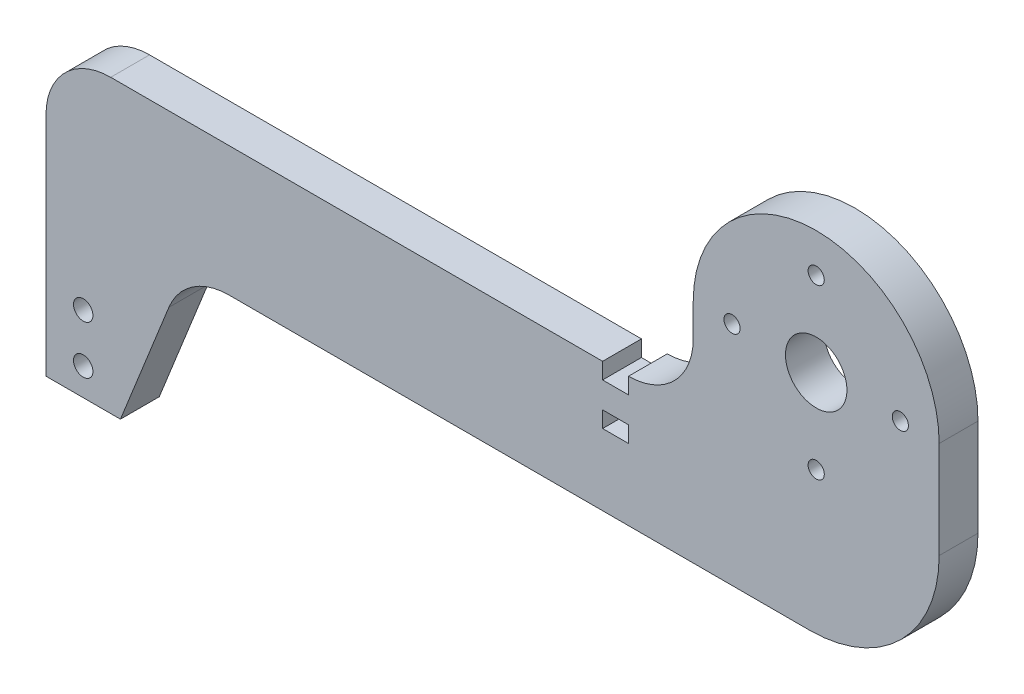
ISO-10303-21;
HEADER;
FILE_DESCRIPTION(('STEP AP214'),'2;1');
FILE_NAME('part.step','',(''),(''),'','','');
FILE_SCHEMA(('AUTOMOTIVE_DESIGN { 1 0 10303 214 1 1 1 1 }'));
ENDSEC;
DATA;
#1=APPLICATION_CONTEXT('core data for automotive mechanical design processes');
#2=APPLICATION_PROTOCOL_DEFINITION('international standard','automotive_design',2000,#1);
#3=PRODUCT_CONTEXT('',#1,'mechanical');
#4=PRODUCT('Part','Part','',(#3));
#5=PRODUCT_RELATED_PRODUCT_CATEGORY('part','',(#4));
#6=PRODUCT_DEFINITION_FORMATION('','',#4);
#7=PRODUCT_DEFINITION_CONTEXT('part definition',#1,'design');
#8=PRODUCT_DEFINITION('design','',#6,#7);
#9=PRODUCT_DEFINITION_SHAPE('','',#8);
#10=(LENGTH_UNIT() NAMED_UNIT(*) SI_UNIT(.MILLI.,.METRE.));
#11=(NAMED_UNIT(*) PLANE_ANGLE_UNIT() SI_UNIT($,.RADIAN.));
#12=(NAMED_UNIT(*) SI_UNIT($,.STERADIAN.) SOLID_ANGLE_UNIT());
#13=UNCERTAINTY_MEASURE_WITH_UNIT(LENGTH_MEASURE(1.E-05),#10,'distance_accuracy_value','');
#14=(GEOMETRIC_REPRESENTATION_CONTEXT(3) GLOBAL_UNCERTAINTY_ASSIGNED_CONTEXT((#13)) GLOBAL_UNIT_ASSIGNED_CONTEXT((#10,
#11,#12)) REPRESENTATION_CONTEXT('',''));
#15=CARTESIAN_POINT('',(0.,0.,0.));
#16=DIRECTION('',(0.,0.,1.));
#17=DIRECTION('',(1.,0.,0.));
#18=AXIS2_PLACEMENT_3D('',#15,#16,#17);
#19=CARTESIAN_POINT('',(0.,-21.5,6.));
#20=DIRECTION('',(0.,1.,0.));
#21=DIRECTION('',(-1.,0.,0.));
#22=AXIS2_PLACEMENT_3D('',#19,#20,#21);
#23=PLANE('',#22);
#24=DIRECTION('',(1.,0.,0.));
#25=VECTOR('',#24,1.);
#26=CARTESIAN_POINT('',(0.,-21.5,0.));
#27=LINE('',#26,#25);
#28=CARTESIAN_POINT('',(-33.,-21.5,0.));
#29=VERTEX_POINT('',#28);
#30=CARTESIAN_POINT('',(-29.,-21.5,0.));
#31=VERTEX_POINT('',#30);
#32=EDGE_CURVE('E287',#29,#31,#27,.T.);
#33=ORIENTED_EDGE('',*,*,#32,.T.);
#34=DIRECTION('',(0.,0.,-1.));
#35=VECTOR('',#34,1.);
#36=CARTESIAN_POINT('',(-29.,-21.5,6.));
#37=LINE('',#36,#35);
#38=CARTESIAN_POINT('',(-29.,-21.5,6.));
#39=VERTEX_POINT('',#38);
#40=EDGE_CURVE('E306',#39,#31,#37,.T.);
#41=ORIENTED_EDGE('',*,*,#40,.F.);
#42=DIRECTION('',(1.,0.,0.));
#43=VECTOR('',#42,1.);
#44=CARTESIAN_POINT('',(0.,-21.5,6.));
#45=LINE('',#44,#43);
#46=CARTESIAN_POINT('',(-33.,-21.5,6.));
#47=VERTEX_POINT('',#46);
#48=EDGE_CURVE('E227',#47,#39,#45,.T.);
#49=ORIENTED_EDGE('',*,*,#48,.F.);
#50=DIRECTION('',(0.,0.,-1.));
#51=VECTOR('',#50,1.);
#52=CARTESIAN_POINT('',(-33.,-21.5,6.));
#53=LINE('',#52,#51);
#54=EDGE_CURVE('E175',#47,#29,#53,.T.);
#55=ORIENTED_EDGE('',*,*,#54,.T.);
#56=EDGE_LOOP('',(#33,#41,#49,#55));
#57=FACE_BOUND('',#56,.T.);
#58=ADVANCED_FACE('F36',(#57),#23,.F.);
#59=CARTESIAN_POINT('',(-29.,0.,6.));
#60=DIRECTION('',(1.,0.,0.));
#61=DIRECTION('',(0.,0.,-1.));
#62=AXIS2_PLACEMENT_3D('',#59,#60,#61);
#63=PLANE('',#62);
#64=DIRECTION('',(0.,-1.,0.));
#65=VECTOR('',#64,1.);
#66=CARTESIAN_POINT('',(-29.,0.,0.));
#67=LINE('',#66,#65);
#68=CARTESIAN_POINT('',(-29.,-24.,0.));
#69=VERTEX_POINT('',#68);
#70=EDGE_CURVE('E290',#31,#69,#67,.T.);
#71=ORIENTED_EDGE('',*,*,#70,.T.);
#72=DIRECTION('',(0.,0.,-1.));
#73=VECTOR('',#72,1.);
#74=CARTESIAN_POINT('',(-29.,-24.,6.));
#75=LINE('',#74,#73);
#76=CARTESIAN_POINT('',(-29.,-24.,6.));
#77=VERTEX_POINT('',#76);
#78=EDGE_CURVE('E304',#77,#69,#75,.T.);
#79=ORIENTED_EDGE('',*,*,#78,.F.);
#80=DIRECTION('',(0.,-1.,0.));
#81=VECTOR('',#80,1.);
#82=CARTESIAN_POINT('',(-29.,0.,6.));
#83=LINE('',#82,#81);
#84=EDGE_CURVE('E230',#39,#77,#83,.T.);
#85=ORIENTED_EDGE('',*,*,#84,.F.);
#86=ORIENTED_EDGE('',*,*,#40,.T.);
#87=EDGE_LOOP('',(#71,#79,#85,#86));
#88=FACE_BOUND('',#87,.T.);
#89=ADVANCED_FACE('F424',(#88),#63,.F.);
#90=CARTESIAN_POINT('',(0.,-24.,6.));
#91=DIRECTION('',(0.,1.,0.));
#92=DIRECTION('',(0.,0.,1.));
#93=AXIS2_PLACEMENT_3D('',#90,#91,#92);
#94=PLANE('',#93);
#95=DIRECTION('',(1.,0.,0.));
#96=VECTOR('',#95,1.);
#97=CARTESIAN_POINT('',(0.,-24.,0.));
#98=LINE('',#97,#96);
#99=CARTESIAN_POINT('',(-33.,-24.,0.));
#100=VERTEX_POINT('',#99);
#101=EDGE_CURVE('E293',#100,#69,#98,.T.);
#102=ORIENTED_EDGE('',*,*,#101,.F.);
#103=DIRECTION('',(0.,0.,-1.));
#104=VECTOR('',#103,1.);
#105=CARTESIAN_POINT('',(-33.,-24.,6.));
#106=LINE('',#105,#104);
#107=CARTESIAN_POINT('',(-33.,-24.,6.));
#108=VERTEX_POINT('',#107);
#109=EDGE_CURVE('E302',#108,#100,#106,.T.);
#110=ORIENTED_EDGE('',*,*,#109,.F.);
#111=DIRECTION('',(1.,0.,0.));
#112=VECTOR('',#111,1.);
#113=CARTESIAN_POINT('',(0.,-24.,6.));
#114=LINE('',#113,#112);
#115=EDGE_CURVE('E232',#108,#77,#114,.T.);
#116=ORIENTED_EDGE('',*,*,#115,.T.);
#117=ORIENTED_EDGE('',*,*,#78,.T.);
#118=EDGE_LOOP('',(#102,#110,#116,#117));
#119=FACE_BOUND('',#118,.T.);
#120=ADVANCED_FACE('F430',(#119),#94,.T.);
#121=CARTESIAN_POINT('',(0.,-59.9999999999999,6.));
#122=DIRECTION('',(0.,-1.,0.));
#123=DIRECTION('',(1.,0.,0.));
#124=AXIS2_PLACEMENT_3D('',#121,#122,#123);
#125=PLANE('',#124);
#126=DIRECTION('',(-1.,0.,0.));
#127=VECTOR('',#126,1.);
#128=CARTESIAN_POINT('',(0.,-59.9999999999999,0.));
#129=LINE('',#128,#127);
#130=CARTESIAN_POINT('',(-107.5,-60.,0.));
#131=VERTEX_POINT('',#130);
#132=CARTESIAN_POINT('',(-119.,-60.,0.));
#133=VERTEX_POINT('',#132);
#134=EDGE_CURVE('E173',#131,#133,#129,.T.);
#135=ORIENTED_EDGE('',*,*,#134,.F.);
#136=DIRECTION('',(0.,0.,-1.));
#137=VECTOR('',#136,1.);
#138=CARTESIAN_POINT('',(-107.5,-60.,6.));
#139=LINE('',#138,#137);
#140=CARTESIAN_POINT('',(-107.5,-60.,6.));
#141=VERTEX_POINT('',#140);
#142=EDGE_CURVE('E167',#141,#131,#139,.T.);
#143=ORIENTED_EDGE('',*,*,#142,.F.);
#144=DIRECTION('',(-1.,0.,0.));
#145=VECTOR('',#144,1.);
#146=CARTESIAN_POINT('',(0.,-59.9999999999999,6.));
#147=LINE('',#146,#145);
#148=CARTESIAN_POINT('',(-119.,-60.,6.));
#149=VERTEX_POINT('',#148);
#150=EDGE_CURVE('E170',#141,#149,#147,.T.);
#151=ORIENTED_EDGE('',*,*,#150,.T.);
#152=DIRECTION('',(0.,0.,-1.));
#153=VECTOR('',#152,1.);
#154=CARTESIAN_POINT('',(-119.,-60.,6.));
#155=LINE('',#154,#153);
#156=EDGE_CURVE('E244',#149,#133,#155,.T.);
#157=ORIENTED_EDGE('',*,*,#156,.T.);
#158=EDGE_LOOP('',(#135,#143,#151,#157));
#159=FACE_BOUND('',#158,.T.);
#160=ADVANCED_FACE('F168',(#159),#125,.T.);
#161=CARTESIAN_POINT('',(-71.9827586206896,28.7931034482759,6.));
#162=DIRECTION('',(-0.928476690885259,0.371390676354104,0.));
#163=DIRECTION('',(-0.371390676354105,-0.928476690885259,0.));
#164=AXIS2_PLACEMENT_3D('',#161,#162,#163);
#165=PLANE('',#164);
#166=DIRECTION('',(0.371390676354105,0.928476690885259,0.));
#167=VECTOR('',#166,1.);
#168=CARTESIAN_POINT('',(-71.9827586206896,28.7931034482759,0.));
#169=LINE('',#168,#167);
#170=CARTESIAN_POINT('',(-100.014437294584,-41.2860932364589,0.));
#171=VERTEX_POINT('',#170);
#172=EDGE_CURVE('E246',#131,#171,#169,.T.);
#173=ORIENTED_EDGE('',*,*,#172,.T.);
#174=DIRECTION('',(0.,0.,-1.));
#175=VECTOR('',#174,1.);
#176=CARTESIAN_POINT('',(-100.014437294584,-41.286093236459,6.));
#177=LINE('',#176,#175);
#178=CARTESIAN_POINT('',(-100.014437294584,-41.2860932364589,6.));
#179=VERTEX_POINT('',#178);
#180=EDGE_CURVE('E51',#171,#179,#177,.F.);
#181=ORIENTED_EDGE('',*,*,#180,.T.);
#182=DIRECTION('',(0.371390676354105,0.928476690885259,0.));
#183=VECTOR('',#182,1.);
#184=CARTESIAN_POINT('',(-71.9827586206896,28.7931034482759,6.));
#185=LINE('',#184,#183);
#186=EDGE_CURVE('E178',#141,#179,#185,.T.);
#187=ORIENTED_EDGE('',*,*,#186,.F.);
#188=ORIENTED_EDGE('',*,*,#142,.T.);
#189=EDGE_LOOP('',(#173,#181,#187,#188));
#190=FACE_BOUND('',#189,.T.);
#191=ADVANCED_FACE('F179',(#190),#165,.F.);
#192=CARTESIAN_POINT('',(0.,-35.,6.));
#193=DIRECTION('',(0.,1.,0.));
#194=DIRECTION('',(0.,0.,1.));
#195=AXIS2_PLACEMENT_3D('',#192,#193,#194);
#196=PLANE('',#195);
#197=DIRECTION('',(1.,0.,0.));
#198=VECTOR('',#197,1.);
#199=CARTESIAN_POINT('',(0.,-35.,6.));
#200=LINE('',#199,#198);
#201=CARTESIAN_POINT('',(-90.729670385731,-35.,6.));
#202=VERTEX_POINT('',#201);
#203=CARTESIAN_POINT('',(-1.,-35.,6.));
#204=VERTEX_POINT('',#203);
#205=EDGE_CURVE('E180',#202,#204,#200,.T.);
#206=ORIENTED_EDGE('',*,*,#205,.F.);
#207=DIRECTION('',(0.,0.,-1.));
#208=VECTOR('',#207,1.);
#209=CARTESIAN_POINT('',(-90.729670385731,-35.,0.));
#210=LINE('',#209,#208);
#211=CARTESIAN_POINT('',(-90.729670385731,-35.,0.));
#212=VERTEX_POINT('',#211);
#213=EDGE_CURVE('E350',#202,#212,#210,.T.);
#214=ORIENTED_EDGE('',*,*,#213,.T.);
#215=DIRECTION('',(1.,0.,0.));
#216=VECTOR('',#215,1.);
#217=CARTESIAN_POINT('',(0.,-35.,0.));
#218=LINE('',#217,#216);
#219=CARTESIAN_POINT('',(-1.,-35.,0.));
#220=VERTEX_POINT('',#219);
#221=EDGE_CURVE('E248',#212,#220,#218,.T.);
#222=ORIENTED_EDGE('',*,*,#221,.T.);
#223=DIRECTION('',(0.,0.,-1.));
#224=VECTOR('',#223,1.);
#225=CARTESIAN_POINT('',(-1.,-35.,6.));
#226=LINE('',#225,#224);
#227=EDGE_CURVE('E336',#220,#204,#226,.F.);
#228=ORIENTED_EDGE('',*,*,#227,.T.);
#229=EDGE_LOOP('',(#206,#214,#222,#228));
#230=FACE_BOUND('',#229,.T.);
#231=ADVANCED_FACE('F360',(#230),#196,.F.);
#232=CARTESIAN_POINT('',(19.,0.,6.));
#233=DIRECTION('',(-1.,0.,0.));
#234=DIRECTION('',(0.,0.,1.));
#235=AXIS2_PLACEMENT_3D('',#232,#233,#234);
#236=PLANE('',#235);
#237=DIRECTION('',(0.,1.,0.));
#238=VECTOR('',#237,1.);
#239=CARTESIAN_POINT('',(19.,0.,6.));
#240=LINE('',#239,#238);
#241=CARTESIAN_POINT('',(19.,-15.,6.));
#242=VERTEX_POINT('',#241);
#243=CARTESIAN_POINT('',(19.,0.,6.));
#244=VERTEX_POINT('',#243);
#245=EDGE_CURVE('E194',#242,#244,#240,.T.);
#246=ORIENTED_EDGE('',*,*,#245,.F.);
#247=DIRECTION('',(0.,0.,-1.));
#248=VECTOR('',#247,1.);
#249=CARTESIAN_POINT('',(19.,-15.,6.));
#250=LINE('',#249,#248);
#251=CARTESIAN_POINT('',(19.,-15.,0.));
#252=VERTEX_POINT('',#251);
#253=EDGE_CURVE('E330',#242,#252,#250,.T.);
#254=ORIENTED_EDGE('',*,*,#253,.T.);
#255=DIRECTION('',(0.,1.,0.));
#256=VECTOR('',#255,1.);
#257=CARTESIAN_POINT('',(19.,0.,0.));
#258=LINE('',#257,#256);
#259=CARTESIAN_POINT('',(19.,0.,0.));
#260=VERTEX_POINT('',#259);
#261=EDGE_CURVE('E250',#252,#260,#258,.T.);
#262=ORIENTED_EDGE('',*,*,#261,.T.);
#263=DIRECTION('',(0.,0.,-1.));
#264=VECTOR('',#263,1.);
#265=CARTESIAN_POINT('',(19.,0.,6.));
#266=LINE('',#265,#264);
#267=EDGE_CURVE('E176',#244,#260,#266,.T.);
#268=ORIENTED_EDGE('',*,*,#267,.F.);
#269=EDGE_LOOP('',(#246,#254,#262,#268));
#270=FACE_BOUND('',#269,.T.);
#271=ADVANCED_FACE('F368',(#270),#236,.F.);
#272=CARTESIAN_POINT('',(0.,0.,6.));
#273=DIRECTION('',(0.,0.,-1.));
#274=DIRECTION('',(-1.,0.,0.));
#275=AXIS2_PLACEMENT_3D('',#272,#273,#274);
#276=CYLINDRICAL_SURFACE('',#275,19.);
#277=CARTESIAN_POINT('',(0.,0.,0.));
#278=DIRECTION('',(0.,0.,1.));
#279=DIRECTION('',(1.,0.,0.));
#280=AXIS2_PLACEMENT_3D('',#277,#278,#279);
#281=CIRCLE('',#280,19.);
#282=CARTESIAN_POINT('',(-19.,0.,0.));
#283=VERTEX_POINT('',#282);
#284=EDGE_CURVE('E252',#260,#283,#281,.T.);
#285=ORIENTED_EDGE('',*,*,#284,.T.);
#286=DIRECTION('',(0.,0.,-1.));
#287=VECTOR('',#286,1.);
#288=CARTESIAN_POINT('',(-19.,0.,6.));
#289=LINE('',#288,#287);
#290=CARTESIAN_POINT('',(-19.,0.,6.));
#291=VERTEX_POINT('',#290);
#292=EDGE_CURVE('E320',#291,#283,#289,.T.);
#293=ORIENTED_EDGE('',*,*,#292,.F.);
#294=CARTESIAN_POINT('',(0.,0.,6.));
#295=DIRECTION('',(0.,0.,1.));
#296=DIRECTION('',(1.,0.,0.));
#297=AXIS2_PLACEMENT_3D('',#294,#295,#296);
#298=CIRCLE('',#297,19.);
#299=EDGE_CURVE('E196',#244,#291,#298,.T.);
#300=ORIENTED_EDGE('',*,*,#299,.F.);
#301=ORIENTED_EDGE('',*,*,#267,.T.);
#302=EDGE_LOOP('',(#285,#293,#300,#301));
#303=FACE_BOUND('',#302,.T.);
#304=ADVANCED_FACE('F375',(#303),#276,.T.);
#305=CARTESIAN_POINT('',(-19.,0.,6.));
#306=DIRECTION('',(1.,0.,0.));
#307=DIRECTION('',(0.,0.,-1.));
#308=AXIS2_PLACEMENT_3D('',#305,#306,#307);
#309=PLANE('',#308);
#310=DIRECTION('',(0.,-1.,0.));
#311=VECTOR('',#310,1.);
#312=CARTESIAN_POINT('',(-19.,0.,0.));
#313=LINE('',#312,#311);
#314=CARTESIAN_POINT('',(-19.,-5.00000000000001,0.));
#315=VERTEX_POINT('',#314);
#316=EDGE_CURVE('E254',#283,#315,#313,.T.);
#317=ORIENTED_EDGE('',*,*,#316,.T.);
#318=DIRECTION('',(0.,0.,-1.));
#319=VECTOR('',#318,1.);
#320=CARTESIAN_POINT('',(-19.,-5.00000000000001,6.));
#321=LINE('',#320,#319);
#322=CARTESIAN_POINT('',(-19.,-5.00000000000001,6.));
#323=VERTEX_POINT('',#322);
#324=EDGE_CURVE('E309',#315,#323,#321,.F.);
#325=ORIENTED_EDGE('',*,*,#324,.T.);
#326=DIRECTION('',(0.,-1.,0.));
#327=VECTOR('',#326,1.);
#328=CARTESIAN_POINT('',(-19.,0.,6.));
#329=LINE('',#328,#327);
#330=EDGE_CURVE('E198',#291,#323,#329,.T.);
#331=ORIENTED_EDGE('',*,*,#330,.F.);
#332=ORIENTED_EDGE('',*,*,#292,.T.);
#333=EDGE_LOOP('',(#317,#325,#331,#332));
#334=FACE_BOUND('',#333,.T.);
#335=ADVANCED_FACE('F665',(#334),#309,.F.);
#336=CARTESIAN_POINT('',(-29.,0.,6.));
#337=DIRECTION('',(1.,0.,0.));
#338=DIRECTION('',(0.,0.,-1.));
#339=AXIS2_PLACEMENT_3D('',#336,#337,#338);
#340=PLANE('',#339);
#341=DIRECTION('',(0.,-1.,0.));
#342=VECTOR('',#341,1.);
#343=CARTESIAN_POINT('',(-29.,0.,0.));
#344=LINE('',#343,#342);
#345=CARTESIAN_POINT('',(-29.,-15.,0.));
#346=VERTEX_POINT('',#345);
#347=CARTESIAN_POINT('',(-29.,-17.5,0.));
#348=VERTEX_POINT('',#347);
#349=EDGE_CURVE('E257',#346,#348,#344,.T.);
#350=ORIENTED_EDGE('',*,*,#349,.T.);
#351=DIRECTION('',(0.,0.,-1.));
#352=VECTOR('',#351,1.);
#353=CARTESIAN_POINT('',(-29.,-17.5,6.));
#354=LINE('',#353,#352);
#355=CARTESIAN_POINT('',(-29.,-17.5,6.));
#356=VERTEX_POINT('',#355);
#357=EDGE_CURVE('E315',#356,#348,#354,.T.);
#358=ORIENTED_EDGE('',*,*,#357,.F.);
#359=DIRECTION('',(0.,-1.,0.));
#360=VECTOR('',#359,1.);
#361=CARTESIAN_POINT('',(-29.,0.,6.));
#362=LINE('',#361,#360);
#363=CARTESIAN_POINT('',(-29.,-15.,6.));
#364=VERTEX_POINT('',#363);
#365=EDGE_CURVE('E201',#364,#356,#362,.T.);
#366=ORIENTED_EDGE('',*,*,#365,.F.);
#367=DIRECTION('',(0.,0.,-1.));
#368=VECTOR('',#367,1.);
#369=CARTESIAN_POINT('',(-29.,-15.,6.));
#370=LINE('',#369,#368);
#371=EDGE_CURVE('E317',#364,#346,#370,.T.);
#372=ORIENTED_EDGE('',*,*,#371,.T.);
#373=EDGE_LOOP('',(#350,#358,#366,#372));
#374=FACE_BOUND('',#373,.T.);
#375=ADVANCED_FACE('F387',(#374),#340,.F.);
#376=CARTESIAN_POINT('',(0.,-17.5,6.));
#377=DIRECTION('',(0.,1.,0.));
#378=DIRECTION('',(0.,0.,1.));
#379=AXIS2_PLACEMENT_3D('',#376,#377,#378);
#380=PLANE('',#379);
#381=DIRECTION('',(1.,0.,0.));
#382=VECTOR('',#381,1.);
#383=CARTESIAN_POINT('',(0.,-17.5,0.));
#384=LINE('',#383,#382);
#385=CARTESIAN_POINT('',(-33.,-17.5,0.));
#386=VERTEX_POINT('',#385);
#387=EDGE_CURVE('E265',#386,#348,#384,.T.);
#388=ORIENTED_EDGE('',*,*,#387,.F.);
#389=DIRECTION('',(0.,0.,-1.));
#390=VECTOR('',#389,1.);
#391=CARTESIAN_POINT('',(-33.,-17.5,6.));
#392=LINE('',#391,#390);
#393=CARTESIAN_POINT('',(-33.,-17.5,6.));
#394=VERTEX_POINT('',#393);
#395=EDGE_CURVE('E313',#394,#386,#392,.T.);
#396=ORIENTED_EDGE('',*,*,#395,.F.);
#397=DIRECTION('',(1.,0.,0.));
#398=VECTOR('',#397,1.);
#399=CARTESIAN_POINT('',(0.,-17.5,6.));
#400=LINE('',#399,#398);
#401=EDGE_CURVE('E206',#394,#356,#400,.T.);
#402=ORIENTED_EDGE('',*,*,#401,.T.);
#403=ORIENTED_EDGE('',*,*,#357,.T.);
#404=EDGE_LOOP('',(#388,#396,#402,#403));
#405=FACE_BOUND('',#404,.T.);
#406=ADVANCED_FACE('F393',(#405),#380,.T.);
#407=CARTESIAN_POINT('',(-33.,0.,6.));
#408=DIRECTION('',(1.,0.,0.));
#409=DIRECTION('',(0.,1.,0.));
#410=AXIS2_PLACEMENT_3D('',#407,#408,#409);
#411=PLANE('',#410);
#412=DIRECTION('',(0.,-1.,0.));
#413=VECTOR('',#412,1.);
#414=CARTESIAN_POINT('',(-33.,0.,0.));
#415=LINE('',#414,#413);
#416=CARTESIAN_POINT('',(-33.,-15.,0.));
#417=VERTEX_POINT('',#416);
#418=EDGE_CURVE('E262',#417,#386,#415,.T.);
#419=ORIENTED_EDGE('',*,*,#418,.F.);
#420=DIRECTION('',(0.,0.,-1.));
#421=VECTOR('',#420,1.);
#422=CARTESIAN_POINT('',(-33.,-15.,6.));
#423=LINE('',#422,#421);
#424=CARTESIAN_POINT('',(-33.,-15.,6.));
#425=VERTEX_POINT('',#424);
#426=EDGE_CURVE('E311',#425,#417,#423,.T.);
#427=ORIENTED_EDGE('',*,*,#426,.F.);
#428=DIRECTION('',(0.,-1.,0.));
#429=VECTOR('',#428,1.);
#430=CARTESIAN_POINT('',(-33.,0.,6.));
#431=LINE('',#430,#429);
#432=EDGE_CURVE('E204',#425,#394,#431,.T.);
#433=ORIENTED_EDGE('',*,*,#432,.T.);
#434=ORIENTED_EDGE('',*,*,#395,.T.);
#435=EDGE_LOOP('',(#419,#427,#433,#434));
#436=FACE_BOUND('',#435,.T.);
#437=ADVANCED_FACE('F397',(#436),#411,.T.);
#438=CARTESIAN_POINT('',(0.,-15.,6.));
#439=DIRECTION('',(0.,-1.,0.));
#440=DIRECTION('',(1.,0.,0.));
#441=AXIS2_PLACEMENT_3D('',#438,#439,#440);
#442=PLANE('',#441);
#443=DIRECTION('',(-1.,0.,0.));
#444=VECTOR('',#443,1.);
#445=CARTESIAN_POINT('',(0.,-15.,0.));
#446=LINE('',#445,#444);
#447=CARTESIAN_POINT('',(-109.,-15.,0.));
#448=VERTEX_POINT('',#447);
#449=EDGE_CURVE('E258',#417,#448,#446,.T.);
#450=ORIENTED_EDGE('',*,*,#449,.T.);
#451=DIRECTION('',(0.,0.,-1.));
#452=VECTOR('',#451,1.);
#453=CARTESIAN_POINT('',(-109.,-15.,6.));
#454=LINE('',#453,#452);
#455=CARTESIAN_POINT('',(-109.,-15.,6.));
#456=VERTEX_POINT('',#455);
#457=EDGE_CURVE('E346',#448,#456,#454,.F.);
#458=ORIENTED_EDGE('',*,*,#457,.T.);
#459=DIRECTION('',(-1.,0.,0.));
#460=VECTOR('',#459,1.);
#461=CARTESIAN_POINT('',(0.,-15.,6.));
#462=LINE('',#461,#460);
#463=EDGE_CURVE('E202',#425,#456,#462,.T.);
#464=ORIENTED_EDGE('',*,*,#463,.F.);
#465=ORIENTED_EDGE('',*,*,#426,.T.);
#466=EDGE_LOOP('',(#450,#458,#464,#465));
#467=FACE_BOUND('',#466,.T.);
#468=ADVANCED_FACE('F400',(#467),#442,.F.);
#469=CARTESIAN_POINT('',(-113.25,-55.75,6.));
#470=DIRECTION('',(0.,0.,-1.));
#471=DIRECTION('',(-1.,0.,0.));
#472=AXIS2_PLACEMENT_3D('',#469,#470,#471);
#473=CYLINDRICAL_SURFACE('',#472,1.5);
#474=CARTESIAN_POINT('',(-113.25,-55.75,6.));
#475=DIRECTION('',(0.,0.,1.));
#476=DIRECTION('',(1.,0.,0.));
#477=AXIS2_PLACEMENT_3D('',#474,#475,#476);
#478=CIRCLE('',#477,1.5);
#479=CARTESIAN_POINT('',(-111.75,-55.75,6.));
#480=VERTEX_POINT('',#479);
#481=EDGE_CURVE('E238',#480,#480,#478,.T.);
#482=ORIENTED_EDGE('',*,*,#481,.T.);
#483=EDGE_LOOP('',(#482));
#484=FACE_BOUND('',#483,.T.);
#485=CARTESIAN_POINT('',(-113.25,-55.75,0.));
#486=DIRECTION('',(0.,0.,1.));
#487=DIRECTION('',(1.,0.,0.));
#488=AXIS2_PLACEMENT_3D('',#485,#486,#487);
#489=CIRCLE('',#488,1.5);
#490=CARTESIAN_POINT('',(-111.75,-55.75,0.));
#491=VERTEX_POINT('',#490);
#492=EDGE_CURVE('E190',#491,#491,#489,.T.);
#493=ORIENTED_EDGE('',*,*,#492,.F.);
#494=EDGE_LOOP('',(#493));
#495=FACE_BOUND('',#494,.T.);
#496=ADVANCED_FACE('F473',(#484,#495),#473,.F.);
#497=CARTESIAN_POINT('',(-33.,0.,6.));
#498=DIRECTION('',(1.,0.,0.));
#499=DIRECTION('',(0.,0.,-1.));
#500=AXIS2_PLACEMENT_3D('',#497,#498,#499);
#501=PLANE('',#500);
#502=DIRECTION('',(0.,-1.,0.));
#503=VECTOR('',#502,1.);
#504=CARTESIAN_POINT('',(-33.,0.,0.));
#505=LINE('',#504,#503);
#506=EDGE_CURVE('E296',#29,#100,#505,.T.);
#507=ORIENTED_EDGE('',*,*,#506,.F.);
#508=ORIENTED_EDGE('',*,*,#54,.F.);
#509=DIRECTION('',(0.,-1.,0.));
#510=VECTOR('',#509,1.);
#511=CARTESIAN_POINT('',(-33.,0.,6.));
#512=LINE('',#511,#510);
#513=EDGE_CURVE('E235',#47,#108,#512,.T.);
#514=ORIENTED_EDGE('',*,*,#513,.T.);
#515=ORIENTED_EDGE('',*,*,#109,.T.);
#516=EDGE_LOOP('',(#507,#508,#514,#515));
#517=FACE_BOUND('',#516,.T.);
#518=ADVANCED_FACE('F439',(#517),#501,.T.);
#519=CARTESIAN_POINT('',(0.,0.,6.));
#520=DIRECTION('',(0.,0.,-1.));
#521=DIRECTION('',(-1.,0.,0.));
#522=AXIS2_PLACEMENT_3D('',#519,#520,#521);
#523=CYLINDRICAL_SURFACE('',#522,4.75);
#524=CARTESIAN_POINT('',(0.,0.,6.));
#525=DIRECTION('',(0.,0.,1.));
#526=DIRECTION('',(1.,0.,0.));
#527=AXIS2_PLACEMENT_3D('',#524,#525,#526);
#528=CIRCLE('',#527,4.75);
#529=CARTESIAN_POINT('',(4.75,0.,6.));
#530=VERTEX_POINT('',#529);
#531=EDGE_CURVE('E224',#530,#530,#528,.T.);
#532=ORIENTED_EDGE('',*,*,#531,.T.);
#533=EDGE_LOOP('',(#532));
#534=FACE_BOUND('',#533,.T.);
#535=CARTESIAN_POINT('',(0.,0.,0.));
#536=DIRECTION('',(0.,0.,1.));
#537=DIRECTION('',(1.,0.,0.));
#538=AXIS2_PLACEMENT_3D('',#535,#536,#537);
#539=CIRCLE('',#538,4.75);
#540=CARTESIAN_POINT('',(4.75,0.,0.));
#541=VERTEX_POINT('',#540);
#542=EDGE_CURVE('E284',#541,#541,#539,.T.);
#543=ORIENTED_EDGE('',*,*,#542,.F.);
#544=EDGE_LOOP('',(#543));
#545=FACE_BOUND('',#544,.T.);
#546=ADVANCED_FACE('F435',(#534,#545),#523,.F.);
#547=CARTESIAN_POINT('',(0.,13.,6.));
#548=DIRECTION('',(0.,0.,-1.));
#549=DIRECTION('',(-1.,0.,0.));
#550=AXIS2_PLACEMENT_3D('',#547,#548,#549);
#551=CYLINDRICAL_SURFACE('',#550,1.25);
#552=CARTESIAN_POINT('',(0.,13.,6.));
#553=DIRECTION('',(0.,0.,1.));
#554=DIRECTION('',(1.,0.,0.));
#555=AXIS2_PLACEMENT_3D('',#552,#553,#554);
#556=CIRCLE('',#555,1.25);
#557=CARTESIAN_POINT('',(1.25,13.,6.));
#558=VERTEX_POINT('',#557);
#559=EDGE_CURVE('E221',#558,#558,#556,.T.);
#560=ORIENTED_EDGE('',*,*,#559,.T.);
#561=EDGE_LOOP('',(#560));
#562=FACE_BOUND('',#561,.T.);
#563=CARTESIAN_POINT('',(0.,13.,0.));
#564=DIRECTION('',(0.,0.,1.));
#565=DIRECTION('',(1.,0.,0.));
#566=AXIS2_PLACEMENT_3D('',#563,#564,#565);
#567=CIRCLE('',#566,1.25);
#568=CARTESIAN_POINT('',(1.25,13.,0.));
#569=VERTEX_POINT('',#568);
#570=EDGE_CURVE('E281',#569,#569,#567,.T.);
#571=ORIENTED_EDGE('',*,*,#570,.F.);
#572=EDGE_LOOP('',(#571));
#573=FACE_BOUND('',#572,.T.);
#574=ADVANCED_FACE('F438',(#562,#573),#551,.F.);
#575=CARTESIAN_POINT('',(13.,0.,6.));
#576=DIRECTION('',(0.,0.,-1.));
#577=DIRECTION('',(-1.,0.,0.));
#578=AXIS2_PLACEMENT_3D('',#575,#576,#577);
#579=CYLINDRICAL_SURFACE('',#578,1.25);
#580=CARTESIAN_POINT('',(13.,0.,6.));
#581=DIRECTION('',(0.,0.,1.));
#582=DIRECTION('',(1.,0.,0.));
#583=AXIS2_PLACEMENT_3D('',#580,#581,#582);
#584=CIRCLE('',#583,1.25);
#585=CARTESIAN_POINT('',(14.25,0.,6.));
#586=VERTEX_POINT('',#585);
#587=EDGE_CURVE('E218',#586,#586,#584,.T.);
#588=ORIENTED_EDGE('',*,*,#587,.T.);
#589=EDGE_LOOP('',(#588));
#590=FACE_BOUND('',#589,.T.);
#591=CARTESIAN_POINT('',(13.,0.,0.));
#592=DIRECTION('',(0.,0.,1.));
#593=DIRECTION('',(1.,0.,0.));
#594=AXIS2_PLACEMENT_3D('',#591,#592,#593);
#595=CIRCLE('',#594,1.25);
#596=CARTESIAN_POINT('',(14.25,0.,0.));
#597=VERTEX_POINT('',#596);
#598=EDGE_CURVE('E278',#597,#597,#595,.T.);
#599=ORIENTED_EDGE('',*,*,#598,.F.);
#600=EDGE_LOOP('',(#599));
#601=FACE_BOUND('',#600,.T.);
#602=ADVANCED_FACE('F443',(#590,#601),#579,.F.);
#603=CARTESIAN_POINT('',(0.,-13.,6.));
#604=DIRECTION('',(0.,0.,-1.));
#605=DIRECTION('',(-1.,0.,0.));
#606=AXIS2_PLACEMENT_3D('',#603,#604,#605);
#607=CYLINDRICAL_SURFACE('',#606,1.25);
#608=CARTESIAN_POINT('',(0.,-13.,6.));
#609=DIRECTION('',(0.,0.,1.));
#610=DIRECTION('',(1.,0.,0.));
#611=AXIS2_PLACEMENT_3D('',#608,#609,#610);
#612=CIRCLE('',#611,1.25);
#613=CARTESIAN_POINT('',(1.25,-13.,6.));
#614=VERTEX_POINT('',#613);
#615=EDGE_CURVE('E215',#614,#614,#612,.T.);
#616=ORIENTED_EDGE('',*,*,#615,.T.);
#617=EDGE_LOOP('',(#616));
#618=FACE_BOUND('',#617,.T.);
#619=CARTESIAN_POINT('',(0.,-13.,0.));
#620=DIRECTION('',(0.,0.,1.));
#621=DIRECTION('',(1.,0.,0.));
#622=AXIS2_PLACEMENT_3D('',#619,#620,#621);
#623=CIRCLE('',#622,1.25);
#624=CARTESIAN_POINT('',(1.25,-13.,0.));
#625=VERTEX_POINT('',#624);
#626=EDGE_CURVE('E275',#625,#625,#623,.T.);
#627=ORIENTED_EDGE('',*,*,#626,.F.);
#628=EDGE_LOOP('',(#627));
#629=FACE_BOUND('',#628,.T.);
#630=ADVANCED_FACE('F419',(#618,#629),#607,.F.);
#631=CARTESIAN_POINT('',(-13.,0.,6.));
#632=DIRECTION('',(0.,0.,-1.));
#633=DIRECTION('',(-1.,0.,0.));
#634=AXIS2_PLACEMENT_3D('',#631,#632,#633);
#635=CYLINDRICAL_SURFACE('',#634,1.25);
#636=CARTESIAN_POINT('',(-13.,0.,6.));
#637=DIRECTION('',(0.,0.,1.));
#638=DIRECTION('',(1.,0.,0.));
#639=AXIS2_PLACEMENT_3D('',#636,#637,#638);
#640=CIRCLE('',#639,1.25);
#641=CARTESIAN_POINT('',(-11.75,0.,6.));
#642=VERTEX_POINT('',#641);
#643=EDGE_CURVE('E212',#642,#642,#640,.T.);
#644=ORIENTED_EDGE('',*,*,#643,.T.);
#645=EDGE_LOOP('',(#644));
#646=FACE_BOUND('',#645,.T.);
#647=CARTESIAN_POINT('',(-13.,0.,0.));
#648=DIRECTION('',(0.,0.,1.));
#649=DIRECTION('',(1.,0.,0.));
#650=AXIS2_PLACEMENT_3D('',#647,#648,#649);
#651=CIRCLE('',#650,1.25);
#652=CARTESIAN_POINT('',(-11.75,0.,0.));
#653=VERTEX_POINT('',#652);
#654=EDGE_CURVE('E272',#653,#653,#651,.T.);
#655=ORIENTED_EDGE('',*,*,#654,.F.);
#656=EDGE_LOOP('',(#655));
#657=FACE_BOUND('',#656,.T.);
#658=ADVANCED_FACE('F411',(#646,#657),#635,.F.);
#659=CARTESIAN_POINT('',(-119.,0.,6.));
#660=DIRECTION('',(-1.,0.,0.));
#661=DIRECTION('',(0.,-1.,0.));
#662=AXIS2_PLACEMENT_3D('',#659,#660,#661);
#663=PLANE('',#662);
#664=DIRECTION('',(0.,1.,0.));
#665=VECTOR('',#664,1.);
#666=CARTESIAN_POINT('',(-119.,0.,6.));
#667=LINE('',#666,#665);
#668=CARTESIAN_POINT('',(-119.,-25.,6.));
#669=VERTEX_POINT('',#668);
#670=EDGE_CURVE('E186',#149,#669,#667,.T.);
#671=ORIENTED_EDGE('',*,*,#670,.T.);
#672=DIRECTION('',(0.,0.,-1.));
#673=VECTOR('',#672,1.);
#674=CARTESIAN_POINT('',(-119.,-25.,0.));
#675=LINE('',#674,#673);
#676=CARTESIAN_POINT('',(-119.,-25.,0.));
#677=VERTEX_POINT('',#676);
#678=EDGE_CURVE('E341',#669,#677,#675,.T.);
#679=ORIENTED_EDGE('',*,*,#678,.T.);
#680=DIRECTION('',(0.,1.,0.));
#681=VECTOR('',#680,1.);
#682=CARTESIAN_POINT('',(-119.,0.,0.));
#683=LINE('',#682,#681);
#684=EDGE_CURVE('E261',#133,#677,#683,.T.);
#685=ORIENTED_EDGE('',*,*,#684,.F.);
#686=ORIENTED_EDGE('',*,*,#156,.F.);
#687=EDGE_LOOP('',(#671,#679,#685,#686));
#688=FACE_BOUND('',#687,.T.);
#689=ADVANCED_FACE('F408',(#688),#663,.T.);
#690=CARTESIAN_POINT('',(-113.25,-48.25,6.));
#691=DIRECTION('',(0.,0.,-1.));
#692=DIRECTION('',(-1.,0.,0.));
#693=AXIS2_PLACEMENT_3D('',#690,#691,#692);
#694=CYLINDRICAL_SURFACE('',#693,1.5);
#695=CARTESIAN_POINT('',(-113.25,-48.25,6.));
#696=DIRECTION('',(0.,0.,1.));
#697=DIRECTION('',(1.,0.,0.));
#698=AXIS2_PLACEMENT_3D('',#695,#696,#697);
#699=CIRCLE('',#698,1.5);
#700=CARTESIAN_POINT('',(-111.75,-48.25,6.));
#701=VERTEX_POINT('',#700);
#702=EDGE_CURVE('E241',#701,#701,#699,.T.);
#703=ORIENTED_EDGE('',*,*,#702,.T.);
#704=EDGE_LOOP('',(#703));
#705=FACE_BOUND('',#704,.T.);
#706=CARTESIAN_POINT('',(-113.25,-48.25,0.));
#707=DIRECTION('',(0.,0.,1.));
#708=DIRECTION('',(1.,0.,0.));
#709=AXIS2_PLACEMENT_3D('',#706,#707,#708);
#710=CIRCLE('',#709,1.5);
#711=CARTESIAN_POINT('',(-111.75,-48.25,0.));
#712=VERTEX_POINT('',#711);
#713=EDGE_CURVE('E187',#712,#712,#710,.T.);
#714=ORIENTED_EDGE('',*,*,#713,.F.);
#715=EDGE_LOOP('',(#714));
#716=FACE_BOUND('',#715,.T.);
#717=ADVANCED_FACE('F410',(#705,#716),#694,.F.);
#718=CARTESIAN_POINT('',(0.,0.,6.));
#719=DIRECTION('',(0.,0.,1.));
#720=DIRECTION('',(1.,0.,0.));
#721=AXIS2_PLACEMENT_3D('',#718,#719,#720);
#722=PLANE('',#721);
#723=ORIENTED_EDGE('',*,*,#463,.T.);
#724=CARTESIAN_POINT('',(-109.,-25.,6.));
#725=DIRECTION('',(0.,0.,1.));
#726=DIRECTION('',(1.,0.,0.));
#727=AXIS2_PLACEMENT_3D('',#724,#725,#726);
#728=CIRCLE('',#727,10.);
#729=EDGE_CURVE('E348',#456,#669,#728,.T.);
#730=ORIENTED_EDGE('',*,*,#729,.T.);
#731=ORIENTED_EDGE('',*,*,#670,.F.);
#732=ORIENTED_EDGE('',*,*,#150,.F.);
#733=ORIENTED_EDGE('',*,*,#186,.T.);
#734=CARTESIAN_POINT('',(-90.729670385731,-45.,6.));
#735=DIRECTION('',(0.,0.,1.));
#736=DIRECTION('',(1.,0.,0.));
#737=AXIS2_PLACEMENT_3D('',#734,#735,#736);
#738=CIRCLE('',#737,10.);
#739=EDGE_CURVE('E11',#179,#202,#738,.F.);
#740=ORIENTED_EDGE('',*,*,#739,.T.);
#741=ORIENTED_EDGE('',*,*,#205,.T.);
#742=CARTESIAN_POINT('',(-1.,-15.,6.));
#743=DIRECTION('',(0.,0.,1.));
#744=DIRECTION('',(1.,0.,0.));
#745=AXIS2_PLACEMENT_3D('',#742,#743,#744);
#746=CIRCLE('',#745,20.);
#747=EDGE_CURVE('E339',#204,#242,#746,.T.);
#748=ORIENTED_EDGE('',*,*,#747,.T.);
#749=ORIENTED_EDGE('',*,*,#245,.T.);
#750=ORIENTED_EDGE('',*,*,#299,.T.);
#751=ORIENTED_EDGE('',*,*,#330,.T.);
#752=CARTESIAN_POINT('',(-29.,-5.00000000000001,6.));
#753=DIRECTION('',(0.,0.,1.));
#754=DIRECTION('',(1.,0.,0.));
#755=AXIS2_PLACEMENT_3D('',#752,#753,#754);
#756=CIRCLE('',#755,10.);
#757=EDGE_CURVE('E328',#323,#364,#756,.F.);
#758=ORIENTED_EDGE('',*,*,#757,.T.);
#759=ORIENTED_EDGE('',*,*,#365,.T.);
#760=ORIENTED_EDGE('',*,*,#401,.F.);
#761=ORIENTED_EDGE('',*,*,#432,.F.);
#762=EDGE_LOOP('',(#723,#730,#731,#732,#733,#740,#741,#748,#749,#750,#751,#758,#759,#760,#761));
#763=FACE_BOUND('',#762,.T.);
#764=ORIENTED_EDGE('',*,*,#643,.F.);
#765=EDGE_LOOP('',(#764));
#766=FACE_BOUND('',#765,.T.);
#767=ORIENTED_EDGE('',*,*,#615,.F.);
#768=EDGE_LOOP('',(#767));
#769=FACE_BOUND('',#768,.T.);
#770=ORIENTED_EDGE('',*,*,#587,.F.);
#771=EDGE_LOOP('',(#770));
#772=FACE_BOUND('',#771,.T.);
#773=ORIENTED_EDGE('',*,*,#559,.F.);
#774=EDGE_LOOP('',(#773));
#775=FACE_BOUND('',#774,.T.);
#776=ORIENTED_EDGE('',*,*,#531,.F.);
#777=EDGE_LOOP('',(#776));
#778=FACE_BOUND('',#777,.T.);
#779=ORIENTED_EDGE('',*,*,#48,.T.);
#780=ORIENTED_EDGE('',*,*,#84,.T.);
#781=ORIENTED_EDGE('',*,*,#115,.F.);
#782=ORIENTED_EDGE('',*,*,#513,.F.);
#783=EDGE_LOOP('',(#779,#780,#781,#782));
#784=FACE_BOUND('',#783,.T.);
#785=ORIENTED_EDGE('',*,*,#481,.F.);
#786=EDGE_LOOP('',(#785));
#787=FACE_BOUND('',#786,.T.);
#788=ORIENTED_EDGE('',*,*,#702,.F.);
#789=EDGE_LOOP('',(#788));
#790=FACE_BOUND('',#789,.T.);
#791=ADVANCED_FACE('F183',(#763,#766,#769,#772,#775,#778,#784,#787,#790),#722,.T.);
#792=CARTESIAN_POINT('',(0.,0.,0.));
#793=DIRECTION('',(0.,0.,1.));
#794=DIRECTION('',(1.,0.,0.));
#795=AXIS2_PLACEMENT_3D('',#792,#793,#794);
#796=PLANE('',#795);
#797=ORIENTED_EDGE('',*,*,#684,.T.);
#798=CARTESIAN_POINT('',(-109.,-25.,0.));
#799=DIRECTION('',(0.,0.,1.));
#800=DIRECTION('',(1.,0.,0.));
#801=AXIS2_PLACEMENT_3D('',#798,#799,#800);
#802=CIRCLE('',#801,10.);
#803=EDGE_CURVE('E344',#677,#448,#802,.F.);
#804=ORIENTED_EDGE('',*,*,#803,.T.);
#805=ORIENTED_EDGE('',*,*,#449,.F.);
#806=ORIENTED_EDGE('',*,*,#418,.T.);
#807=ORIENTED_EDGE('',*,*,#387,.T.);
#808=ORIENTED_EDGE('',*,*,#349,.F.);
#809=CARTESIAN_POINT('',(-29.,-5.00000000000001,0.));
#810=DIRECTION('',(0.,0.,1.));
#811=DIRECTION('',(1.,0.,0.));
#812=AXIS2_PLACEMENT_3D('',#809,#810,#811);
#813=CIRCLE('',#812,10.);
#814=EDGE_CURVE('E326',#346,#315,#813,.T.);
#815=ORIENTED_EDGE('',*,*,#814,.T.);
#816=ORIENTED_EDGE('',*,*,#316,.F.);
#817=ORIENTED_EDGE('',*,*,#284,.F.);
#818=ORIENTED_EDGE('',*,*,#261,.F.);
#819=CARTESIAN_POINT('',(-1.,-15.,0.));
#820=DIRECTION('',(0.,0.,1.));
#821=DIRECTION('',(1.,0.,0.));
#822=AXIS2_PLACEMENT_3D('',#819,#820,#821);
#823=CIRCLE('',#822,20.);
#824=EDGE_CURVE('E333',#252,#220,#823,.F.);
#825=ORIENTED_EDGE('',*,*,#824,.T.);
#826=ORIENTED_EDGE('',*,*,#221,.F.);
#827=CARTESIAN_POINT('',(-90.729670385731,-45.,0.));
#828=DIRECTION('',(0.,0.,1.));
#829=DIRECTION('',(1.,0.,0.));
#830=AXIS2_PLACEMENT_3D('',#827,#828,#829);
#831=CIRCLE('',#830,10.);
#832=EDGE_CURVE('E44',#212,#171,#831,.T.);
#833=ORIENTED_EDGE('',*,*,#832,.T.);
#834=ORIENTED_EDGE('',*,*,#172,.F.);
#835=ORIENTED_EDGE('',*,*,#134,.T.);
#836=EDGE_LOOP('',(#797,#804,#805,#806,#807,#808,#815,#816,#817,#818,#825,#826,#833,#834,#835));
#837=FACE_BOUND('',#836,.T.);
#838=ORIENTED_EDGE('',*,*,#654,.T.);
#839=EDGE_LOOP('',(#838));
#840=FACE_BOUND('',#839,.T.);
#841=ORIENTED_EDGE('',*,*,#626,.T.);
#842=EDGE_LOOP('',(#841));
#843=FACE_BOUND('',#842,.T.);
#844=ORIENTED_EDGE('',*,*,#598,.T.);
#845=EDGE_LOOP('',(#844));
#846=FACE_BOUND('',#845,.T.);
#847=ORIENTED_EDGE('',*,*,#570,.T.);
#848=EDGE_LOOP('',(#847));
#849=FACE_BOUND('',#848,.T.);
#850=ORIENTED_EDGE('',*,*,#542,.T.);
#851=EDGE_LOOP('',(#850));
#852=FACE_BOUND('',#851,.T.);
#853=ORIENTED_EDGE('',*,*,#32,.F.);
#854=ORIENTED_EDGE('',*,*,#506,.T.);
#855=ORIENTED_EDGE('',*,*,#101,.T.);
#856=ORIENTED_EDGE('',*,*,#70,.F.);
#857=EDGE_LOOP('',(#853,#854,#855,#856));
#858=FACE_BOUND('',#857,.T.);
#859=ORIENTED_EDGE('',*,*,#492,.T.);
#860=EDGE_LOOP('',(#859));
#861=FACE_BOUND('',#860,.T.);
#862=ORIENTED_EDGE('',*,*,#713,.T.);
#863=EDGE_LOOP('',(#862));
#864=FACE_BOUND('',#863,.T.);
#865=ADVANCED_FACE('F355',(#837,#840,#843,#846,#849,#852,#858,#861,#864),#796,.F.);
#866=CARTESIAN_POINT('',(-29.,-5.00000000000001,6.));
#867=DIRECTION('',(0.,0.,1.));
#868=DIRECTION('',(1.,0.,0.));
#869=AXIS2_PLACEMENT_3D('',#866,#867,#868);
#870=CYLINDRICAL_SURFACE('',#869,10.);
#871=ORIENTED_EDGE('',*,*,#757,.F.);
#872=ORIENTED_EDGE('',*,*,#324,.F.);
#873=ORIENTED_EDGE('',*,*,#814,.F.);
#874=ORIENTED_EDGE('',*,*,#371,.F.);
#875=EDGE_LOOP('',(#871,#872,#873,#874));
#876=FACE_BOUND('',#875,.T.);
#877=ADVANCED_FACE('F384',(#876),#870,.F.);
#878=CARTESIAN_POINT('',(-1.,-15.,6.));
#879=DIRECTION('',(0.,0.,-1.));
#880=DIRECTION('',(-1.,0.,0.));
#881=AXIS2_PLACEMENT_3D('',#878,#879,#880);
#882=CYLINDRICAL_SURFACE('',#881,20.);
#883=ORIENTED_EDGE('',*,*,#747,.F.);
#884=ORIENTED_EDGE('',*,*,#227,.F.);
#885=ORIENTED_EDGE('',*,*,#824,.F.);
#886=ORIENTED_EDGE('',*,*,#253,.F.);
#887=EDGE_LOOP('',(#883,#884,#885,#886));
#888=FACE_BOUND('',#887,.T.);
#889=ADVANCED_FACE('F371',(#888),#882,.T.);
#890=CARTESIAN_POINT('',(-109.,-25.,6.));
#891=DIRECTION('',(0.,0.,1.));
#892=DIRECTION('',(1.,0.,0.));
#893=AXIS2_PLACEMENT_3D('',#890,#891,#892);
#894=CYLINDRICAL_SURFACE('',#893,10.);
#895=ORIENTED_EDGE('',*,*,#729,.F.);
#896=ORIENTED_EDGE('',*,*,#457,.F.);
#897=ORIENTED_EDGE('',*,*,#803,.F.);
#898=ORIENTED_EDGE('',*,*,#678,.F.);
#899=EDGE_LOOP('',(#895,#896,#897,#898));
#900=FACE_BOUND('',#899,.T.);
#901=ADVANCED_FACE('F405',(#900),#894,.T.);
#902=CARTESIAN_POINT('',(-90.729670385731,-45.,6.));
#903=DIRECTION('',(0.,0.,1.));
#904=DIRECTION('',(1.,0.,0.));
#905=AXIS2_PLACEMENT_3D('',#902,#903,#904);
#906=CYLINDRICAL_SURFACE('',#905,10.);
#907=ORIENTED_EDGE('',*,*,#739,.F.);
#908=ORIENTED_EDGE('',*,*,#180,.F.);
#909=ORIENTED_EDGE('',*,*,#832,.F.);
#910=ORIENTED_EDGE('',*,*,#213,.F.);
#911=EDGE_LOOP('',(#907,#908,#909,#910));
#912=FACE_BOUND('',#911,.T.);
#913=ADVANCED_FACE('F38',(#912),#906,.F.);
#914=CLOSED_SHELL('',(#58,#89,#120,#160,#191,#231,#271,#304,#335,#375,#406,#437,#468,#496,#518,
#546,#574,#602,#630,#658,#689,#717,#791,#865,#877,#889,#901,#913));
#915=MANIFOLD_SOLID_BREP('B2',#914);
#916=ADVANCED_BREP_SHAPE_REPRESENTATION('',(#18,#915),#14);
#917=SHAPE_DEFINITION_REPRESENTATION(#9,#916);
ENDSEC;
END-ISO-10303-21;
